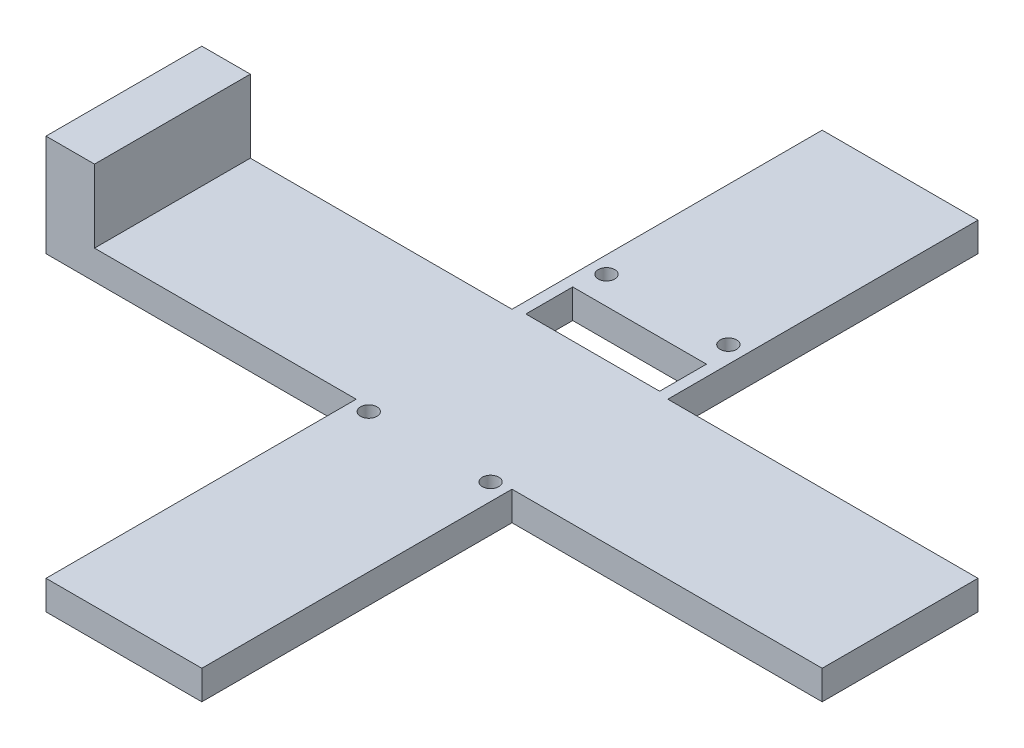
ISO-10303-21;
HEADER;
FILE_DESCRIPTION(('STEP AP214'),'2;1');
FILE_NAME('part.step','',(''),(''),'','','');
FILE_SCHEMA(('AUTOMOTIVE_DESIGN { 1 0 10303 214 1 1 1 1 }'));
ENDSEC;
DATA;
#1=APPLICATION_CONTEXT('core data for automotive mechanical design processes');
#2=APPLICATION_PROTOCOL_DEFINITION('international standard','automotive_design',2000,#1);
#3=PRODUCT_CONTEXT('',#1,'mechanical');
#4=PRODUCT('Part','Part','',(#3));
#5=PRODUCT_RELATED_PRODUCT_CATEGORY('part','',(#4));
#6=PRODUCT_DEFINITION_FORMATION('','',#4);
#7=PRODUCT_DEFINITION_CONTEXT('part definition',#1,'design');
#8=PRODUCT_DEFINITION('design','',#6,#7);
#9=PRODUCT_DEFINITION_SHAPE('','',#8);
#10=(LENGTH_UNIT() NAMED_UNIT(*) SI_UNIT(.MILLI.,.METRE.));
#11=(NAMED_UNIT(*) PLANE_ANGLE_UNIT() SI_UNIT($,.RADIAN.));
#12=(NAMED_UNIT(*) SI_UNIT($,.STERADIAN.) SOLID_ANGLE_UNIT());
#13=UNCERTAINTY_MEASURE_WITH_UNIT(LENGTH_MEASURE(1.E-05),#10,'distance_accuracy_value','');
#14=(GEOMETRIC_REPRESENTATION_CONTEXT(3) GLOBAL_UNCERTAINTY_ASSIGNED_CONTEXT((#13)) GLOBAL_UNIT_ASSIGNED_CONTEXT((#10,
#11,#12)) REPRESENTATION_CONTEXT('',''));
#15=CARTESIAN_POINT('',(0.,0.,0.));
#16=DIRECTION('',(0.,0.,1.));
#17=DIRECTION('',(1.,0.,0.));
#18=AXIS2_PLACEMENT_3D('',#15,#16,#17);
#19=CARTESIAN_POINT('',(0.,6.,0.));
#20=DIRECTION('',(0.,1.,0.));
#21=DIRECTION('',(0.,0.,1.));
#22=AXIS2_PLACEMENT_3D('',#19,#20,#21);
#23=PLANE('',#22);
#24=DIRECTION('',(0.,0.,-1.));
#25=VECTOR('',#24,1.);
#26=CARTESIAN_POINT('',(-70.0000000000002,6.,-20.06));
#27=LINE('',#26,#25);
#28=CARTESIAN_POINT('',(-70.0000000000002,6.,12.06));
#29=VERTEX_POINT('',#28);
#30=CARTESIAN_POINT('',(-70.0000000000002,6.,-20.06));
#31=VERTEX_POINT('',#30);
#32=EDGE_CURVE('E55',#29,#31,#27,.T.);
#33=ORIENTED_EDGE('',*,*,#32,.F.);
#34=DIRECTION('',(1.,0.,0.));
#35=VECTOR('',#34,1.);
#36=CARTESIAN_POINT('',(-80.0000000000002,6.,12.06));
#37=LINE('',#36,#35);
#38=CARTESIAN_POINT('',(-16.0600000000001,6.,12.06));
#39=VERTEX_POINT('',#38);
#40=EDGE_CURVE('E291',#29,#39,#37,.T.);
#41=ORIENTED_EDGE('',*,*,#40,.T.);
#42=DIRECTION('',(0.,0.,1.));
#43=VECTOR('',#42,1.);
#44=CARTESIAN_POINT('',(-16.0600000000001,6.,12.06));
#45=LINE('',#44,#43);
#46=CARTESIAN_POINT('',(-16.0600000000002,6.,76.));
#47=VERTEX_POINT('',#46);
#48=EDGE_CURVE('E294',#39,#47,#45,.T.);
#49=ORIENTED_EDGE('',*,*,#48,.T.);
#50=DIRECTION('',(1.,0.,0.));
#51=VECTOR('',#50,1.);
#52=CARTESIAN_POINT('',(-16.0600000000002,6.,76.));
#53=LINE('',#52,#51);
#54=CARTESIAN_POINT('',(16.06,6.,76.));
#55=VERTEX_POINT('',#54);
#56=EDGE_CURVE('E297',#47,#55,#53,.T.);
#57=ORIENTED_EDGE('',*,*,#56,.T.);
#58=DIRECTION('',(0.,0.,-1.));
#59=VECTOR('',#58,1.);
#60=CARTESIAN_POINT('',(16.06,6.,76.));
#61=LINE('',#60,#59);
#62=CARTESIAN_POINT('',(16.06,6.,12.06));
#63=VERTEX_POINT('',#62);
#64=EDGE_CURVE('E300',#55,#63,#61,.T.);
#65=ORIENTED_EDGE('',*,*,#64,.T.);
#66=DIRECTION('',(1.,0.,0.));
#67=VECTOR('',#66,1.);
#68=CARTESIAN_POINT('',(16.06,6.,12.06));
#69=LINE('',#68,#67);
#70=CARTESIAN_POINT('',(80.,6.,12.06));
#71=VERTEX_POINT('',#70);
#72=EDGE_CURVE('E303',#63,#71,#69,.T.);
#73=ORIENTED_EDGE('',*,*,#72,.T.);
#74=DIRECTION('',(0.,0.,-1.));
#75=VECTOR('',#74,1.);
#76=CARTESIAN_POINT('',(80.,6.,-4.00000000000001));
#77=LINE('',#76,#75);
#78=CARTESIAN_POINT('',(80.,6.,-20.06));
#79=VERTEX_POINT('',#78);
#80=EDGE_CURVE('E306',#71,#79,#77,.T.);
#81=ORIENTED_EDGE('',*,*,#80,.T.);
#82=DIRECTION('',(-1.,0.,0.));
#83=VECTOR('',#82,1.);
#84=CARTESIAN_POINT('',(80.,6.,-20.06));
#85=LINE('',#84,#83);
#86=CARTESIAN_POINT('',(16.06,6.,-20.06));
#87=VERTEX_POINT('',#86);
#88=EDGE_CURVE('E309',#79,#87,#85,.T.);
#89=ORIENTED_EDGE('',*,*,#88,.T.);
#90=DIRECTION('',(0.,0.,-1.));
#91=VECTOR('',#90,1.);
#92=CARTESIAN_POINT('',(16.06,6.,-20.06));
#93=LINE('',#92,#91);
#94=CARTESIAN_POINT('',(16.06,6.,-84.));
#95=VERTEX_POINT('',#94);
#96=EDGE_CURVE('E312',#87,#95,#93,.T.);
#97=ORIENTED_EDGE('',*,*,#96,.T.);
#98=DIRECTION('',(-1.,0.,0.));
#99=VECTOR('',#98,1.);
#100=CARTESIAN_POINT('',(16.06,6.,-84.));
#101=LINE('',#100,#99);
#102=CARTESIAN_POINT('',(-16.0600000000002,6.,-84.));
#103=VERTEX_POINT('',#102);
#104=EDGE_CURVE('E281',#95,#103,#101,.T.);
#105=ORIENTED_EDGE('',*,*,#104,.T.);
#106=DIRECTION('',(0.,0.,1.));
#107=VECTOR('',#106,1.);
#108=CARTESIAN_POINT('',(-16.0600000000002,6.,-84.));
#109=LINE('',#108,#107);
#110=CARTESIAN_POINT('',(-16.0600000000001,6.,-20.06));
#111=VERTEX_POINT('',#110);
#112=EDGE_CURVE('E284',#103,#111,#109,.T.);
#113=ORIENTED_EDGE('',*,*,#112,.T.);
#114=DIRECTION('',(-1.,0.,0.));
#115=VECTOR('',#114,1.);
#116=CARTESIAN_POINT('',(-16.0600000000001,6.,-20.06));
#117=LINE('',#116,#115);
#118=EDGE_CURVE('E288',#111,#31,#117,.T.);
#119=ORIENTED_EDGE('',*,*,#118,.T.);
#120=EDGE_LOOP('',(#33,#41,#49,#57,#65,#73,#81,#89,#97,#105,#113,#119));
#121=FACE_BOUND('',#120,.T.);
#122=CARTESIAN_POINT('',(12.56,6.,12.97));
#123=DIRECTION('',(0.,1.,0.));
#124=DIRECTION('',(0.,0.,1.));
#125=AXIS2_PLACEMENT_3D('',#122,#123,#124);
#126=CIRCLE('',#125,1.7);
#127=CARTESIAN_POINT('',(12.56,6.,14.67));
#128=VERTEX_POINT('',#127);
#129=EDGE_CURVE('E216',#128,#128,#126,.T.);
#130=ORIENTED_EDGE('',*,*,#129,.F.);
#131=EDGE_LOOP('',(#130));
#132=FACE_BOUND('',#131,.T.);
#133=CARTESIAN_POINT('',(-12.56,6.,-36.04));
#134=DIRECTION('',(0.,1.,0.));
#135=DIRECTION('',(0.,0.,1.));
#136=AXIS2_PLACEMENT_3D('',#133,#134,#135);
#137=CIRCLE('',#136,1.7);
#138=CARTESIAN_POINT('',(-12.56,6.,-34.34));
#139=VERTEX_POINT('',#138);
#140=EDGE_CURVE('E232',#139,#139,#137,.T.);
#141=ORIENTED_EDGE('',*,*,#140,.F.);
#142=EDGE_LOOP('',(#141));
#143=FACE_BOUND('',#142,.T.);
#144=DIRECTION('',(1.,0.,0.));
#145=VECTOR('',#144,1.);
#146=CARTESIAN_POINT('',(13.785,6.,-20.64));
#147=LINE('',#146,#145);
#148=CARTESIAN_POINT('',(-13.785,6.,-20.64));
#149=VERTEX_POINT('',#148);
#150=CARTESIAN_POINT('',(13.785,6.,-20.64));
#151=VERTEX_POINT('',#150);
#152=EDGE_CURVE('E243',#149,#151,#147,.T.);
#153=ORIENTED_EDGE('',*,*,#152,.F.);
#154=DIRECTION('',(0.,0.,1.));
#155=VECTOR('',#154,1.);
#156=CARTESIAN_POINT('',(-13.785,6.,-20.64));
#157=LINE('',#156,#155);
#158=CARTESIAN_POINT('',(-13.785,6.,-30.3));
#159=VERTEX_POINT('',#158);
#160=EDGE_CURVE('E240',#159,#149,#157,.T.);
#161=ORIENTED_EDGE('',*,*,#160,.F.);
#162=DIRECTION('',(-1.,0.,0.));
#163=VECTOR('',#162,1.);
#164=CARTESIAN_POINT('',(13.785,6.,-30.3));
#165=LINE('',#164,#163);
#166=CARTESIAN_POINT('',(13.785,6.,-30.3));
#167=VERTEX_POINT('',#166);
#168=EDGE_CURVE('E250',#167,#159,#165,.T.);
#169=ORIENTED_EDGE('',*,*,#168,.F.);
#170=DIRECTION('',(0.,0.,-1.));
#171=VECTOR('',#170,1.);
#172=CARTESIAN_POINT('',(13.785,6.,-20.64));
#173=LINE('',#172,#171);
#174=EDGE_CURVE('E247',#151,#167,#173,.T.);
#175=ORIENTED_EDGE('',*,*,#174,.F.);
#176=EDGE_LOOP('',(#153,#161,#169,#175));
#177=FACE_BOUND('',#176,.T.);
#178=CARTESIAN_POINT('',(12.56,6.,-36.04));
#179=DIRECTION('',(0.,1.,0.));
#180=DIRECTION('',(0.,0.,1.));
#181=AXIS2_PLACEMENT_3D('',#178,#179,#180);
#182=CIRCLE('',#181,1.7);
#183=CARTESIAN_POINT('',(12.56,6.,-34.34));
#184=VERTEX_POINT('',#183);
#185=EDGE_CURVE('E224',#184,#184,#182,.T.);
#186=ORIENTED_EDGE('',*,*,#185,.F.);
#187=EDGE_LOOP('',(#186));
#188=FACE_BOUND('',#187,.T.);
#189=CARTESIAN_POINT('',(-12.56,6.,12.97));
#190=DIRECTION('',(0.,1.,0.));
#191=DIRECTION('',(0.,0.,1.));
#192=AXIS2_PLACEMENT_3D('',#189,#190,#191);
#193=CIRCLE('',#192,1.7);
#194=CARTESIAN_POINT('',(-12.56,6.,14.67));
#195=VERTEX_POINT('',#194);
#196=EDGE_CURVE('E208',#195,#195,#193,.T.);
#197=ORIENTED_EDGE('',*,*,#196,.F.);
#198=EDGE_LOOP('',(#197));
#199=FACE_BOUND('',#198,.T.);
#200=ADVANCED_FACE('F39',(#121,#132,#143,#177,#188,#199),#23,.T.);
#201=CARTESIAN_POINT('',(0.,0.,0.));
#202=DIRECTION('',(0.,1.,0.));
#203=DIRECTION('',(0.,0.,1.));
#204=AXIS2_PLACEMENT_3D('',#201,#202,#203);
#205=PLANE('',#204);
#206=DIRECTION('',(-1.,0.,0.));
#207=VECTOR('',#206,1.);
#208=CARTESIAN_POINT('',(1.98438290654698E-13,0.,-84.));
#209=LINE('',#208,#207);
#210=CARTESIAN_POINT('',(16.06,0.,-84.));
#211=VERTEX_POINT('',#210);
#212=CARTESIAN_POINT('',(-16.0600000000002,0.,-84.));
#213=VERTEX_POINT('',#212);
#214=EDGE_CURVE('E280',#211,#213,#209,.T.);
#215=ORIENTED_EDGE('',*,*,#214,.F.);
#216=DIRECTION('',(0.,0.,-1.));
#217=VECTOR('',#216,1.);
#218=CARTESIAN_POINT('',(16.06,0.,-20.06));
#219=LINE('',#218,#217);
#220=CARTESIAN_POINT('',(16.06,0.,-20.06));
#221=VERTEX_POINT('',#220);
#222=EDGE_CURVE('E285',#221,#211,#219,.T.);
#223=ORIENTED_EDGE('',*,*,#222,.F.);
#224=DIRECTION('',(-1.,0.,0.));
#225=VECTOR('',#224,1.);
#226=CARTESIAN_POINT('',(80.,0.,-20.06));
#227=LINE('',#226,#225);
#228=CARTESIAN_POINT('',(80.,0.,-20.06));
#229=VERTEX_POINT('',#228);
#230=EDGE_CURVE('E347',#229,#221,#227,.T.);
#231=ORIENTED_EDGE('',*,*,#230,.F.);
#232=DIRECTION('',(0.,0.,-1.));
#233=VECTOR('',#232,1.);
#234=CARTESIAN_POINT('',(80.,0.,-4.00000000000001));
#235=LINE('',#234,#233);
#236=CARTESIAN_POINT('',(80.,0.,12.06));
#237=VERTEX_POINT('',#236);
#238=EDGE_CURVE('E344',#237,#229,#235,.T.);
#239=ORIENTED_EDGE('',*,*,#238,.F.);
#240=DIRECTION('',(1.,0.,0.));
#241=VECTOR('',#240,1.);
#242=CARTESIAN_POINT('',(16.06,0.,12.06));
#243=LINE('',#242,#241);
#244=CARTESIAN_POINT('',(16.06,0.,12.06));
#245=VERTEX_POINT('',#244);
#246=EDGE_CURVE('E340',#245,#237,#243,.T.);
#247=ORIENTED_EDGE('',*,*,#246,.F.);
#248=DIRECTION('',(0.,0.,-1.));
#249=VECTOR('',#248,1.);
#250=CARTESIAN_POINT('',(16.06,0.,76.));
#251=LINE('',#250,#249);
#252=CARTESIAN_POINT('',(16.06,0.,76.));
#253=VERTEX_POINT('',#252);
#254=EDGE_CURVE('E337',#253,#245,#251,.T.);
#255=ORIENTED_EDGE('',*,*,#254,.F.);
#256=DIRECTION('',(1.,0.,0.));
#257=VECTOR('',#256,1.);
#258=CARTESIAN_POINT('',(0.,0.,76.));
#259=LINE('',#258,#257);
#260=CARTESIAN_POINT('',(-16.0600000000002,0.,76.));
#261=VERTEX_POINT('',#260);
#262=EDGE_CURVE('E334',#261,#253,#259,.T.);
#263=ORIENTED_EDGE('',*,*,#262,.F.);
#264=DIRECTION('',(0.,0.,1.));
#265=VECTOR('',#264,1.);
#266=CARTESIAN_POINT('',(-16.0600000000001,0.,12.06));
#267=LINE('',#266,#265);
#268=CARTESIAN_POINT('',(-16.0600000000001,0.,12.06));
#269=VERTEX_POINT('',#268);
#270=EDGE_CURVE('E330',#269,#261,#267,.T.);
#271=ORIENTED_EDGE('',*,*,#270,.F.);
#272=DIRECTION('',(1.,0.,0.));
#273=VECTOR('',#272,1.);
#274=CARTESIAN_POINT('',(-80.0000000000002,0.,12.06));
#275=LINE('',#274,#273);
#276=CARTESIAN_POINT('',(-80.0000000000002,0.,12.06));
#277=VERTEX_POINT('',#276);
#278=EDGE_CURVE('E327',#277,#269,#275,.T.);
#279=ORIENTED_EDGE('',*,*,#278,.F.);
#280=DIRECTION('',(0.,0.,1.));
#281=VECTOR('',#280,1.);
#282=CARTESIAN_POINT('',(-80.0000000000002,0.,12.06));
#283=LINE('',#282,#281);
#284=CARTESIAN_POINT('',(-80.0000000000002,0.,-20.06));
#285=VERTEX_POINT('',#284);
#286=EDGE_CURVE('E171',#285,#277,#283,.T.);
#287=ORIENTED_EDGE('',*,*,#286,.F.);
#288=DIRECTION('',(-1.,0.,0.));
#289=VECTOR('',#288,1.);
#290=CARTESIAN_POINT('',(-16.0600000000001,0.,-20.06));
#291=LINE('',#290,#289);
#292=CARTESIAN_POINT('',(-16.0600000000001,0.,-20.06));
#293=VERTEX_POINT('',#292);
#294=EDGE_CURVE('E321',#293,#285,#291,.T.);
#295=ORIENTED_EDGE('',*,*,#294,.F.);
#296=DIRECTION('',(0.,0.,1.));
#297=VECTOR('',#296,1.);
#298=CARTESIAN_POINT('',(-16.0600000000002,0.,-84.));
#299=LINE('',#298,#297);
#300=EDGE_CURVE('E318',#213,#293,#299,.T.);
#301=ORIENTED_EDGE('',*,*,#300,.F.);
#302=EDGE_LOOP('',(#215,#223,#231,#239,#247,#255,#263,#271,#279,#287,#295,#301));
#303=FACE_BOUND('',#302,.T.);
#304=DIRECTION('',(0.,0.,1.));
#305=VECTOR('',#304,1.);
#306=CARTESIAN_POINT('',(-13.785,0.,-20.64));
#307=LINE('',#306,#305);
#308=CARTESIAN_POINT('',(-13.785,0.,-30.3));
#309=VERTEX_POINT('',#308);
#310=CARTESIAN_POINT('',(-13.785,0.,-20.64));
#311=VERTEX_POINT('',#310);
#312=EDGE_CURVE('E236',#309,#311,#307,.T.);
#313=ORIENTED_EDGE('',*,*,#312,.T.);
#314=DIRECTION('',(1.,0.,0.));
#315=VECTOR('',#314,1.);
#316=CARTESIAN_POINT('',(13.785,0.,-20.64));
#317=LINE('',#316,#315);
#318=CARTESIAN_POINT('',(13.785,0.,-20.64));
#319=VERTEX_POINT('',#318);
#320=EDGE_CURVE('E257',#311,#319,#317,.T.);
#321=ORIENTED_EDGE('',*,*,#320,.T.);
#322=DIRECTION('',(0.,0.,-1.));
#323=VECTOR('',#322,1.);
#324=CARTESIAN_POINT('',(13.785,0.,-20.64));
#325=LINE('',#324,#323);
#326=CARTESIAN_POINT('',(13.785,0.,-30.3));
#327=VERTEX_POINT('',#326);
#328=EDGE_CURVE('E261',#319,#327,#325,.T.);
#329=ORIENTED_EDGE('',*,*,#328,.T.);
#330=DIRECTION('',(-1.,0.,0.));
#331=VECTOR('',#330,1.);
#332=CARTESIAN_POINT('',(13.785,0.,-30.3));
#333=LINE('',#332,#331);
#334=EDGE_CURVE('E244',#327,#309,#333,.T.);
#335=ORIENTED_EDGE('',*,*,#334,.T.);
#336=EDGE_LOOP('',(#313,#321,#329,#335));
#337=FACE_BOUND('',#336,.T.);
#338=CARTESIAN_POINT('',(-12.56,0.,-36.04));
#339=DIRECTION('',(0.,1.,0.));
#340=DIRECTION('',(0.,0.,1.));
#341=AXIS2_PLACEMENT_3D('',#338,#339,#340);
#342=CIRCLE('',#341,1.7);
#343=CARTESIAN_POINT('',(-12.56,0.,-34.34));
#344=VERTEX_POINT('',#343);
#345=EDGE_CURVE('E228',#344,#344,#342,.T.);
#346=ORIENTED_EDGE('',*,*,#345,.T.);
#347=EDGE_LOOP('',(#346));
#348=FACE_BOUND('',#347,.T.);
#349=CARTESIAN_POINT('',(12.56,0.,-36.04));
#350=DIRECTION('',(0.,1.,0.));
#351=DIRECTION('',(0.,0.,1.));
#352=AXIS2_PLACEMENT_3D('',#349,#350,#351);
#353=CIRCLE('',#352,1.7);
#354=CARTESIAN_POINT('',(12.56,0.,-34.34));
#355=VERTEX_POINT('',#354);
#356=EDGE_CURVE('E220',#355,#355,#353,.T.);
#357=ORIENTED_EDGE('',*,*,#356,.T.);
#358=EDGE_LOOP('',(#357));
#359=FACE_BOUND('',#358,.T.);
#360=CARTESIAN_POINT('',(12.56,0.,12.97));
#361=DIRECTION('',(0.,1.,0.));
#362=DIRECTION('',(0.,0.,1.));
#363=AXIS2_PLACEMENT_3D('',#360,#361,#362);
#364=CIRCLE('',#363,1.7);
#365=CARTESIAN_POINT('',(12.56,0.,14.67));
#366=VERTEX_POINT('',#365);
#367=EDGE_CURVE('E212',#366,#366,#364,.T.);
#368=ORIENTED_EDGE('',*,*,#367,.T.);
#369=EDGE_LOOP('',(#368));
#370=FACE_BOUND('',#369,.T.);
#371=CARTESIAN_POINT('',(-12.56,0.,12.97));
#372=DIRECTION('',(0.,1.,0.));
#373=DIRECTION('',(0.,0.,1.));
#374=AXIS2_PLACEMENT_3D('',#371,#372,#373);
#375=CIRCLE('',#374,1.7);
#376=CARTESIAN_POINT('',(-12.56,0.,14.67));
#377=VERTEX_POINT('',#376);
#378=EDGE_CURVE('E207',#377,#377,#375,.T.);
#379=ORIENTED_EDGE('',*,*,#378,.T.);
#380=EDGE_LOOP('',(#379));
#381=FACE_BOUND('',#380,.T.);
#382=ADVANCED_FACE('F395',(#303,#337,#348,#359,#370,#381),#205,.F.);
#383=CARTESIAN_POINT('',(1.98438290654698E-13,6.,-84.));
#384=DIRECTION('',(0.,0.,1.));
#385=DIRECTION('',(1.,0.,0.));
#386=AXIS2_PLACEMENT_3D('',#383,#384,#385);
#387=PLANE('',#386);
#388=ORIENTED_EDGE('',*,*,#214,.T.);
#389=DIRECTION('',(0.,-1.,0.));
#390=VECTOR('',#389,1.);
#391=CARTESIAN_POINT('',(-16.0600000000002,6.,-84.));
#392=LINE('',#391,#390);
#393=EDGE_CURVE('E11',#103,#213,#392,.T.);
#394=ORIENTED_EDGE('',*,*,#393,.F.);
#395=ORIENTED_EDGE('',*,*,#104,.F.);
#396=DIRECTION('',(0.,-1.,0.));
#397=VECTOR('',#396,1.);
#398=CARTESIAN_POINT('',(16.06,6.,-84.));
#399=LINE('',#398,#397);
#400=EDGE_CURVE('E315',#95,#211,#399,.T.);
#401=ORIENTED_EDGE('',*,*,#400,.T.);
#402=EDGE_LOOP('',(#388,#394,#395,#401));
#403=FACE_BOUND('',#402,.T.);
#404=ADVANCED_FACE('F41',(#403),#387,.F.);
#405=CARTESIAN_POINT('',(-16.0600000000002,6.,-84.));
#406=DIRECTION('',(1.,0.,0.));
#407=DIRECTION('',(0.,0.,-1.));
#408=AXIS2_PLACEMENT_3D('',#405,#406,#407);
#409=PLANE('',#408);
#410=ORIENTED_EDGE('',*,*,#300,.T.);
#411=DIRECTION('',(0.,-1.,0.));
#412=VECTOR('',#411,1.);
#413=CARTESIAN_POINT('',(-16.0600000000001,6.,-20.06));
#414=LINE('',#413,#412);
#415=EDGE_CURVE('E48',#111,#293,#414,.T.);
#416=ORIENTED_EDGE('',*,*,#415,.F.);
#417=ORIENTED_EDGE('',*,*,#112,.F.);
#418=ORIENTED_EDGE('',*,*,#393,.T.);
#419=EDGE_LOOP('',(#410,#416,#417,#418));
#420=FACE_BOUND('',#419,.T.);
#421=ADVANCED_FACE('F461',(#420),#409,.F.);
#422=CARTESIAN_POINT('',(-16.0600000000001,6.,-20.06));
#423=DIRECTION('',(0.,0.,1.));
#424=DIRECTION('',(1.,0.,0.));
#425=AXIS2_PLACEMENT_3D('',#422,#423,#424);
#426=PLANE('',#425);
#427=ORIENTED_EDGE('',*,*,#294,.T.);
#428=DIRECTION('',(0.,-1.,0.));
#429=VECTOR('',#428,1.);
#430=CARTESIAN_POINT('',(-80.0000000000002,6.,-20.06));
#431=LINE('',#430,#429);
#432=CARTESIAN_POINT('',(-80.0000000000002,21.,-20.06));
#433=VERTEX_POINT('',#432);
#434=EDGE_CURVE('E175',#433,#285,#431,.T.);
#435=ORIENTED_EDGE('',*,*,#434,.F.);
#436=DIRECTION('',(-1.,0.,0.));
#437=VECTOR('',#436,1.);
#438=CARTESIAN_POINT('',(-80.0000000000002,21.,-20.06));
#439=LINE('',#438,#437);
#440=CARTESIAN_POINT('',(-70.0000000000002,21.,-20.06));
#441=VERTEX_POINT('',#440);
#442=EDGE_CURVE('E191',#441,#433,#439,.T.);
#443=ORIENTED_EDGE('',*,*,#442,.F.);
#444=DIRECTION('',(0.,-1.,0.));
#445=VECTOR('',#444,1.);
#446=CARTESIAN_POINT('',(-70.0000000000002,21.,-20.06));
#447=LINE('',#446,#445);
#448=EDGE_CURVE('E200',#441,#31,#447,.T.);
#449=ORIENTED_EDGE('',*,*,#448,.T.);
#450=ORIENTED_EDGE('',*,*,#118,.F.);
#451=ORIENTED_EDGE('',*,*,#415,.T.);
#452=EDGE_LOOP('',(#427,#435,#443,#449,#450,#451));
#453=FACE_BOUND('',#452,.T.);
#454=ADVANCED_FACE('F390',(#453),#426,.F.);
#455=CARTESIAN_POINT('',(-80.0000000000002,6.,12.06));
#456=DIRECTION('',(1.,0.,0.));
#457=DIRECTION('',(0.,0.,-1.));
#458=AXIS2_PLACEMENT_3D('',#455,#456,#457);
#459=PLANE('',#458);
#460=ORIENTED_EDGE('',*,*,#286,.T.);
#461=DIRECTION('',(0.,-1.,0.));
#462=VECTOR('',#461,1.);
#463=CARTESIAN_POINT('',(-80.0000000000002,6.,12.06));
#464=LINE('',#463,#462);
#465=CARTESIAN_POINT('',(-80.0000000000002,21.,12.06));
#466=VERTEX_POINT('',#465);
#467=EDGE_CURVE('E165',#466,#277,#464,.T.);
#468=ORIENTED_EDGE('',*,*,#467,.F.);
#469=DIRECTION('',(0.,0.,1.));
#470=VECTOR('',#469,1.);
#471=CARTESIAN_POINT('',(-80.0000000000002,21.,-20.06));
#472=LINE('',#471,#470);
#473=EDGE_CURVE('E170',#433,#466,#472,.T.);
#474=ORIENTED_EDGE('',*,*,#473,.F.);
#475=ORIENTED_EDGE('',*,*,#434,.T.);
#476=EDGE_LOOP('',(#460,#468,#474,#475));
#477=FACE_BOUND('',#476,.T.);
#478=ADVANCED_FACE('F167',(#477),#459,.F.);
#479=CARTESIAN_POINT('',(-80.0000000000002,6.,12.06));
#480=DIRECTION('',(0.,0.,-1.));
#481=DIRECTION('',(-1.,0.,0.));
#482=AXIS2_PLACEMENT_3D('',#479,#480,#481);
#483=PLANE('',#482);
#484=ORIENTED_EDGE('',*,*,#278,.T.);
#485=DIRECTION('',(0.,-1.,0.));
#486=VECTOR('',#485,1.);
#487=CARTESIAN_POINT('',(-16.0600000000001,6.,12.06));
#488=LINE('',#487,#486);
#489=EDGE_CURVE('E176',#39,#269,#488,.T.);
#490=ORIENTED_EDGE('',*,*,#489,.F.);
#491=ORIENTED_EDGE('',*,*,#40,.F.);
#492=DIRECTION('',(0.,-1.,0.));
#493=VECTOR('',#492,1.);
#494=CARTESIAN_POINT('',(-70.0000000000002,21.,12.06));
#495=LINE('',#494,#493);
#496=CARTESIAN_POINT('',(-70.0000000000002,21.,12.06));
#497=VERTEX_POINT('',#496);
#498=EDGE_CURVE('E182',#497,#29,#495,.T.);
#499=ORIENTED_EDGE('',*,*,#498,.F.);
#500=DIRECTION('',(1.,0.,0.));
#501=VECTOR('',#500,1.);
#502=CARTESIAN_POINT('',(-80.0000000000002,21.,12.06));
#503=LINE('',#502,#501);
#504=EDGE_CURVE('E179',#466,#497,#503,.T.);
#505=ORIENTED_EDGE('',*,*,#504,.F.);
#506=ORIENTED_EDGE('',*,*,#467,.T.);
#507=EDGE_LOOP('',(#484,#490,#491,#499,#505,#506));
#508=FACE_BOUND('',#507,.T.);
#509=ADVANCED_FACE('F180',(#508),#483,.F.);
#510=CARTESIAN_POINT('',(-16.0600000000001,6.,12.06));
#511=DIRECTION('',(1.,0.,0.));
#512=DIRECTION('',(0.,0.,-1.));
#513=AXIS2_PLACEMENT_3D('',#510,#511,#512);
#514=PLANE('',#513);
#515=ORIENTED_EDGE('',*,*,#270,.T.);
#516=DIRECTION('',(0.,-1.,0.));
#517=VECTOR('',#516,1.);
#518=CARTESIAN_POINT('',(-16.0600000000002,6.,76.));
#519=LINE('',#518,#517);
#520=EDGE_CURVE('E376',#47,#261,#519,.T.);
#521=ORIENTED_EDGE('',*,*,#520,.F.);
#522=ORIENTED_EDGE('',*,*,#48,.F.);
#523=ORIENTED_EDGE('',*,*,#489,.T.);
#524=EDGE_LOOP('',(#515,#521,#522,#523));
#525=FACE_BOUND('',#524,.T.);
#526=ADVANCED_FACE('F401',(#525),#514,.F.);
#527=CARTESIAN_POINT('',(0.,6.,76.));
#528=DIRECTION('',(0.,0.,-1.));
#529=DIRECTION('',(-1.,0.,0.));
#530=AXIS2_PLACEMENT_3D('',#527,#528,#529);
#531=PLANE('',#530);
#532=ORIENTED_EDGE('',*,*,#262,.T.);
#533=DIRECTION('',(0.,-1.,0.));
#534=VECTOR('',#533,1.);
#535=CARTESIAN_POINT('',(16.06,6.,76.));
#536=LINE('',#535,#534);
#537=EDGE_CURVE('E372',#55,#253,#536,.T.);
#538=ORIENTED_EDGE('',*,*,#537,.F.);
#539=ORIENTED_EDGE('',*,*,#56,.F.);
#540=ORIENTED_EDGE('',*,*,#520,.T.);
#541=EDGE_LOOP('',(#532,#538,#539,#540));
#542=FACE_BOUND('',#541,.T.);
#543=ADVANCED_FACE('F449',(#542),#531,.F.);
#544=CARTESIAN_POINT('',(16.06,6.,76.));
#545=DIRECTION('',(-1.,0.,0.));
#546=DIRECTION('',(0.,0.,1.));
#547=AXIS2_PLACEMENT_3D('',#544,#545,#546);
#548=PLANE('',#547);
#549=ORIENTED_EDGE('',*,*,#254,.T.);
#550=DIRECTION('',(0.,-1.,0.));
#551=VECTOR('',#550,1.);
#552=CARTESIAN_POINT('',(16.06,6.,12.06));
#553=LINE('',#552,#551);
#554=EDGE_CURVE('E368',#63,#245,#553,.T.);
#555=ORIENTED_EDGE('',*,*,#554,.F.);
#556=ORIENTED_EDGE('',*,*,#64,.F.);
#557=ORIENTED_EDGE('',*,*,#537,.T.);
#558=EDGE_LOOP('',(#549,#555,#556,#557));
#559=FACE_BOUND('',#558,.T.);
#560=ADVANCED_FACE('F445',(#559),#548,.F.);
#561=CARTESIAN_POINT('',(16.06,6.,12.06));
#562=DIRECTION('',(0.,0.,-1.));
#563=DIRECTION('',(-1.,0.,0.));
#564=AXIS2_PLACEMENT_3D('',#561,#562,#563);
#565=PLANE('',#564);
#566=ORIENTED_EDGE('',*,*,#246,.T.);
#567=DIRECTION('',(0.,-1.,0.));
#568=VECTOR('',#567,1.);
#569=CARTESIAN_POINT('',(80.,6.,12.06));
#570=LINE('',#569,#568);
#571=EDGE_CURVE('E364',#71,#237,#570,.T.);
#572=ORIENTED_EDGE('',*,*,#571,.F.);
#573=ORIENTED_EDGE('',*,*,#72,.F.);
#574=ORIENTED_EDGE('',*,*,#554,.T.);
#575=EDGE_LOOP('',(#566,#572,#573,#574));
#576=FACE_BOUND('',#575,.T.);
#577=ADVANCED_FACE('F441',(#576),#565,.F.);
#578=CARTESIAN_POINT('',(80.,6.,-4.00000000000001));
#579=DIRECTION('',(-1.,0.,0.));
#580=DIRECTION('',(0.,0.,1.));
#581=AXIS2_PLACEMENT_3D('',#578,#579,#580);
#582=PLANE('',#581);
#583=ORIENTED_EDGE('',*,*,#238,.T.);
#584=DIRECTION('',(0.,-1.,0.));
#585=VECTOR('',#584,1.);
#586=CARTESIAN_POINT('',(80.,6.,-20.06));
#587=LINE('',#586,#585);
#588=EDGE_CURVE('E360',#79,#229,#587,.T.);
#589=ORIENTED_EDGE('',*,*,#588,.F.);
#590=ORIENTED_EDGE('',*,*,#80,.F.);
#591=ORIENTED_EDGE('',*,*,#571,.T.);
#592=EDGE_LOOP('',(#583,#589,#590,#591));
#593=FACE_BOUND('',#592,.T.);
#594=ADVANCED_FACE('F437',(#593),#582,.F.);
#595=CARTESIAN_POINT('',(80.,6.,-20.06));
#596=DIRECTION('',(0.,0.,1.));
#597=DIRECTION('',(1.,0.,0.));
#598=AXIS2_PLACEMENT_3D('',#595,#596,#597);
#599=PLANE('',#598);
#600=ORIENTED_EDGE('',*,*,#230,.T.);
#601=DIRECTION('',(0.,-1.,0.));
#602=VECTOR('',#601,1.);
#603=CARTESIAN_POINT('',(16.06,6.,-20.06));
#604=LINE('',#603,#602);
#605=EDGE_CURVE('E356',#87,#221,#604,.T.);
#606=ORIENTED_EDGE('',*,*,#605,.F.);
#607=ORIENTED_EDGE('',*,*,#88,.F.);
#608=ORIENTED_EDGE('',*,*,#588,.T.);
#609=EDGE_LOOP('',(#600,#606,#607,#608));
#610=FACE_BOUND('',#609,.T.);
#611=ADVANCED_FACE('F433',(#610),#599,.F.);
#612=CARTESIAN_POINT('',(16.06,6.,-20.06));
#613=DIRECTION('',(-1.,0.,0.));
#614=DIRECTION('',(0.,0.,1.));
#615=AXIS2_PLACEMENT_3D('',#612,#613,#614);
#616=PLANE('',#615);
#617=ORIENTED_EDGE('',*,*,#222,.T.);
#618=ORIENTED_EDGE('',*,*,#400,.F.);
#619=ORIENTED_EDGE('',*,*,#96,.F.);
#620=ORIENTED_EDGE('',*,*,#605,.T.);
#621=EDGE_LOOP('',(#617,#618,#619,#620));
#622=FACE_BOUND('',#621,.T.);
#623=ADVANCED_FACE('F430',(#622),#616,.F.);
#624=CARTESIAN_POINT('',(-13.785,6.,-20.64));
#625=DIRECTION('',(1.,0.,0.));
#626=DIRECTION('',(0.,0.,-1.));
#627=AXIS2_PLACEMENT_3D('',#624,#625,#626);
#628=PLANE('',#627);
#629=ORIENTED_EDGE('',*,*,#312,.F.);
#630=DIRECTION('',(0.,-1.,0.));
#631=VECTOR('',#630,1.);
#632=CARTESIAN_POINT('',(-13.785,6.,-30.3));
#633=LINE('',#632,#631);
#634=EDGE_CURVE('E253',#159,#309,#633,.T.);
#635=ORIENTED_EDGE('',*,*,#634,.F.);
#636=ORIENTED_EDGE('',*,*,#160,.T.);
#637=DIRECTION('',(0.,-1.,0.));
#638=VECTOR('',#637,1.);
#639=CARTESIAN_POINT('',(-13.785,6.,-20.64));
#640=LINE('',#639,#638);
#641=EDGE_CURVE('E276',#149,#311,#640,.T.);
#642=ORIENTED_EDGE('',*,*,#641,.T.);
#643=EDGE_LOOP('',(#629,#635,#636,#642));
#644=FACE_BOUND('',#643,.T.);
#645=ADVANCED_FACE('F427',(#644),#628,.T.);
#646=CARTESIAN_POINT('',(13.785,6.,-20.64));
#647=DIRECTION('',(0.,0.,-1.));
#648=DIRECTION('',(-1.,0.,0.));
#649=AXIS2_PLACEMENT_3D('',#646,#647,#648);
#650=PLANE('',#649);
#651=ORIENTED_EDGE('',*,*,#320,.F.);
#652=ORIENTED_EDGE('',*,*,#641,.F.);
#653=ORIENTED_EDGE('',*,*,#152,.T.);
#654=DIRECTION('',(0.,-1.,0.));
#655=VECTOR('',#654,1.);
#656=CARTESIAN_POINT('',(13.785,6.,-20.64));
#657=LINE('',#656,#655);
#658=EDGE_CURVE('E273',#151,#319,#657,.T.);
#659=ORIENTED_EDGE('',*,*,#658,.T.);
#660=EDGE_LOOP('',(#651,#652,#653,#659));
#661=FACE_BOUND('',#660,.T.);
#662=ADVANCED_FACE('F578',(#661),#650,.T.);
#663=CARTESIAN_POINT('',(13.785,6.,-20.64));
#664=DIRECTION('',(-1.,0.,0.));
#665=DIRECTION('',(0.,0.,1.));
#666=AXIS2_PLACEMENT_3D('',#663,#664,#665);
#667=PLANE('',#666);
#668=ORIENTED_EDGE('',*,*,#328,.F.);
#669=ORIENTED_EDGE('',*,*,#658,.F.);
#670=ORIENTED_EDGE('',*,*,#174,.T.);
#671=DIRECTION('',(0.,-1.,0.));
#672=VECTOR('',#671,1.);
#673=CARTESIAN_POINT('',(13.785,6.,-30.3));
#674=LINE('',#673,#672);
#675=EDGE_CURVE('E63',#167,#327,#674,.T.);
#676=ORIENTED_EDGE('',*,*,#675,.T.);
#677=EDGE_LOOP('',(#668,#669,#670,#676));
#678=FACE_BOUND('',#677,.T.);
#679=ADVANCED_FACE('F586',(#678),#667,.T.);
#680=CARTESIAN_POINT('',(13.785,6.,-30.3));
#681=DIRECTION('',(0.,0.,1.));
#682=DIRECTION('',(1.,0.,0.));
#683=AXIS2_PLACEMENT_3D('',#680,#681,#682);
#684=PLANE('',#683);
#685=ORIENTED_EDGE('',*,*,#334,.F.);
#686=ORIENTED_EDGE('',*,*,#675,.F.);
#687=ORIENTED_EDGE('',*,*,#168,.T.);
#688=ORIENTED_EDGE('',*,*,#634,.T.);
#689=EDGE_LOOP('',(#685,#686,#687,#688));
#690=FACE_BOUND('',#689,.T.);
#691=ADVANCED_FACE('F594',(#690),#684,.T.);
#692=CARTESIAN_POINT('',(-12.56,6.,-36.04));
#693=DIRECTION('',(0.,-1.,0.));
#694=DIRECTION('',(0.,0.,-1.));
#695=AXIS2_PLACEMENT_3D('',#692,#693,#694);
#696=CYLINDRICAL_SURFACE('',#695,1.7);
#697=ORIENTED_EDGE('',*,*,#140,.T.);
#698=EDGE_LOOP('',(#697));
#699=FACE_BOUND('',#698,.T.);
#700=ORIENTED_EDGE('',*,*,#345,.F.);
#701=EDGE_LOOP('',(#700));
#702=FACE_BOUND('',#701,.T.);
#703=ADVANCED_FACE('F603',(#699,#702),#696,.F.);
#704=CARTESIAN_POINT('',(12.56,6.,-36.04));
#705=DIRECTION('',(0.,-1.,0.));
#706=DIRECTION('',(0.,0.,-1.));
#707=AXIS2_PLACEMENT_3D('',#704,#705,#706);
#708=CYLINDRICAL_SURFACE('',#707,1.7);
#709=ORIENTED_EDGE('',*,*,#185,.T.);
#710=EDGE_LOOP('',(#709));
#711=FACE_BOUND('',#710,.T.);
#712=ORIENTED_EDGE('',*,*,#356,.F.);
#713=EDGE_LOOP('',(#712));
#714=FACE_BOUND('',#713,.T.);
#715=ADVANCED_FACE('F611',(#711,#714),#708,.F.);
#716=CARTESIAN_POINT('',(12.56,6.,12.97));
#717=DIRECTION('',(0.,-1.,0.));
#718=DIRECTION('',(0.,0.,-1.));
#719=AXIS2_PLACEMENT_3D('',#716,#717,#718);
#720=CYLINDRICAL_SURFACE('',#719,1.7);
#721=ORIENTED_EDGE('',*,*,#129,.T.);
#722=EDGE_LOOP('',(#721));
#723=FACE_BOUND('',#722,.T.);
#724=ORIENTED_EDGE('',*,*,#367,.F.);
#725=EDGE_LOOP('',(#724));
#726=FACE_BOUND('',#725,.T.);
#727=ADVANCED_FACE('F417',(#723,#726),#720,.F.);
#728=CARTESIAN_POINT('',(-12.56,6.,12.97));
#729=DIRECTION('',(0.,-1.,0.));
#730=DIRECTION('',(0.,0.,-1.));
#731=AXIS2_PLACEMENT_3D('',#728,#729,#730);
#732=CYLINDRICAL_SURFACE('',#731,1.7);
#733=ORIENTED_EDGE('',*,*,#196,.T.);
#734=EDGE_LOOP('',(#733));
#735=FACE_BOUND('',#734,.T.);
#736=ORIENTED_EDGE('',*,*,#378,.F.);
#737=EDGE_LOOP('',(#736));
#738=FACE_BOUND('',#737,.T.);
#739=ADVANCED_FACE('F410',(#735,#738),#732,.F.);
#740=CARTESIAN_POINT('',(-70.0000000000002,21.,-20.06));
#741=DIRECTION('',(-1.,0.,0.));
#742=DIRECTION('',(0.,0.,1.));
#743=AXIS2_PLACEMENT_3D('',#740,#741,#742);
#744=PLANE('',#743);
#745=ORIENTED_EDGE('',*,*,#32,.T.);
#746=ORIENTED_EDGE('',*,*,#448,.F.);
#747=DIRECTION('',(0.,0.,-1.));
#748=VECTOR('',#747,1.);
#749=CARTESIAN_POINT('',(-70.0000000000002,21.,-20.06));
#750=LINE('',#749,#748);
#751=EDGE_CURVE('E186',#497,#441,#750,.T.);
#752=ORIENTED_EDGE('',*,*,#751,.F.);
#753=ORIENTED_EDGE('',*,*,#498,.T.);
#754=EDGE_LOOP('',(#745,#746,#752,#753));
#755=FACE_BOUND('',#754,.T.);
#756=ADVANCED_FACE('F407',(#755),#744,.F.);
#757=CARTESIAN_POINT('',(0.,21.,0.));
#758=DIRECTION('',(0.,1.,0.));
#759=DIRECTION('',(0.,0.,1.));
#760=AXIS2_PLACEMENT_3D('',#757,#758,#759);
#761=PLANE('',#760);
#762=ORIENTED_EDGE('',*,*,#473,.T.);
#763=ORIENTED_EDGE('',*,*,#504,.T.);
#764=ORIENTED_EDGE('',*,*,#751,.T.);
#765=ORIENTED_EDGE('',*,*,#442,.T.);
#766=EDGE_LOOP('',(#762,#763,#764,#765));
#767=FACE_BOUND('',#766,.T.);
#768=ADVANCED_FACE('F189',(#767),#761,.T.);
#769=CLOSED_SHELL('',(#200,#382,#404,#421,#454,#478,#509,#526,#543,#560,#577,#594,#611,#623,
#645,#662,#679,#691,#703,#715,#727,#739,#756,#768));
#770=MANIFOLD_SOLID_BREP('B2',#769);
#771=ADVANCED_BREP_SHAPE_REPRESENTATION('',(#18,#770),#14);
#772=SHAPE_DEFINITION_REPRESENTATION(#9,#771);
ENDSEC;
END-ISO-10303-21;
